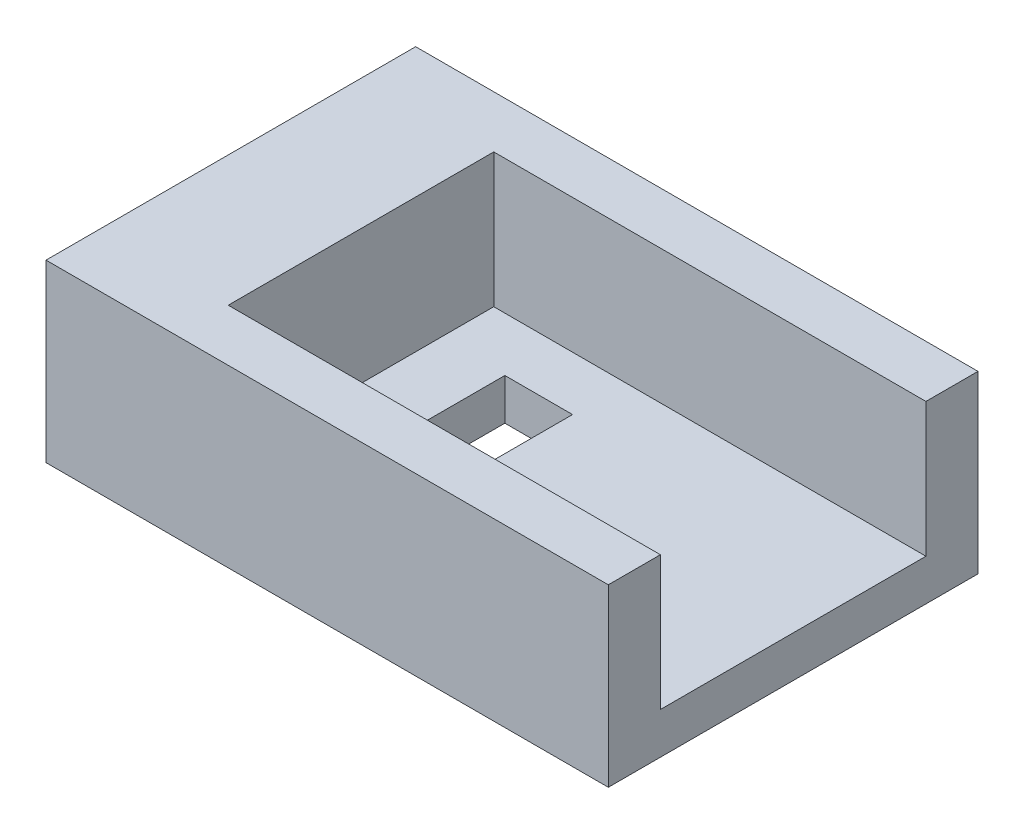
ISO-10303-21;
HEADER;
FILE_DESCRIPTION(('STEP AP214'),'2;1');
FILE_NAME('part.step','',(''),(''),'','','');
FILE_SCHEMA(('AUTOMOTIVE_DESIGN { 1 0 10303 214 1 1 1 1 }'));
ENDSEC;
DATA;
#1=APPLICATION_CONTEXT('core data for automotive mechanical design processes');
#2=APPLICATION_PROTOCOL_DEFINITION('international standard','automotive_design',2000,#1);
#3=PRODUCT_CONTEXT('',#1,'mechanical');
#4=PRODUCT('Part','Part','',(#3));
#5=PRODUCT_RELATED_PRODUCT_CATEGORY('part','',(#4));
#6=PRODUCT_DEFINITION_FORMATION('','',#4);
#7=PRODUCT_DEFINITION_CONTEXT('part definition',#1,'design');
#8=PRODUCT_DEFINITION('design','',#6,#7);
#9=PRODUCT_DEFINITION_SHAPE('','',#8);
#10=(LENGTH_UNIT() NAMED_UNIT(*) SI_UNIT(.MILLI.,.METRE.));
#11=(NAMED_UNIT(*) PLANE_ANGLE_UNIT() SI_UNIT($,.RADIAN.));
#12=(NAMED_UNIT(*) SI_UNIT($,.STERADIAN.) SOLID_ANGLE_UNIT());
#13=UNCERTAINTY_MEASURE_WITH_UNIT(LENGTH_MEASURE(1.E-05),#10,'distance_accuracy_value','');
#14=(GEOMETRIC_REPRESENTATION_CONTEXT(3) GLOBAL_UNCERTAINTY_ASSIGNED_CONTEXT((#13)) GLOBAL_UNIT_ASSIGNED_CONTEXT((#10,
#11,#12)) REPRESENTATION_CONTEXT('',''));
#15=CARTESIAN_POINT('',(0.,0.,0.));
#16=DIRECTION('',(0.,0.,1.));
#17=DIRECTION('',(1.,0.,0.));
#18=AXIS2_PLACEMENT_3D('',#15,#16,#17);
#19=CARTESIAN_POINT('',(0.,13.4747,0.));
#20=DIRECTION('',(1.,0.,0.));
#21=DIRECTION('',(0.,0.,-1.));
#22=AXIS2_PLACEMENT_3D('',#19,#20,#21);
#23=PLANE('',#22);
#24=DIRECTION('',(0.,0.,1.));
#25=VECTOR('',#24,1.);
#26=CARTESIAN_POINT('',(0.,0.,0.));
#27=LINE('',#26,#25);
#28=CARTESIAN_POINT('',(0.,0.,-28.39974));
#29=VERTEX_POINT('',#28);
#30=CARTESIAN_POINT('',(0.,0.,0.));
#31=VERTEX_POINT('',#30);
#32=EDGE_CURVE('E214',#29,#31,#27,.T.);
#33=ORIENTED_EDGE('',*,*,#32,.T.);
#34=DIRECTION('',(0.,-1.,0.));
#35=VECTOR('',#34,1.);
#36=CARTESIAN_POINT('',(0.,13.4747,0.));
#37=LINE('',#36,#35);
#38=CARTESIAN_POINT('',(0.,13.4747,0.));
#39=VERTEX_POINT('',#38);
#40=EDGE_CURVE('E11',#39,#31,#37,.T.);
#41=ORIENTED_EDGE('',*,*,#40,.F.);
#42=DIRECTION('',(0.,0.,1.));
#43=VECTOR('',#42,1.);
#44=CARTESIAN_POINT('',(0.,13.4747,0.));
#45=LINE('',#44,#43);
#46=CARTESIAN_POINT('',(0.,13.4747,-28.39974));
#47=VERTEX_POINT('',#46);
#48=EDGE_CURVE('E223',#47,#39,#45,.T.);
#49=ORIENTED_EDGE('',*,*,#48,.F.);
#50=DIRECTION('',(0.,-1.,0.));
#51=VECTOR('',#50,1.);
#52=CARTESIAN_POINT('',(0.,13.4747,-28.39974));
#53=LINE('',#52,#51);
#54=EDGE_CURVE('E239',#47,#29,#53,.T.);
#55=ORIENTED_EDGE('',*,*,#54,.T.);
#56=EDGE_LOOP('',(#33,#41,#49,#55));
#57=FACE_BOUND('',#56,.T.);
#58=ADVANCED_FACE('F45',(#57),#23,.F.);
#59=CARTESIAN_POINT('',(0.,13.4747,0.));
#60=DIRECTION('',(0.,0.,-1.));
#61=DIRECTION('',(-1.,0.,0.));
#62=AXIS2_PLACEMENT_3D('',#59,#60,#61);
#63=PLANE('',#62);
#64=DIRECTION('',(1.,0.,0.));
#65=VECTOR('',#64,1.);
#66=CARTESIAN_POINT('',(0.,0.,0.));
#67=LINE('',#66,#65);
#68=CARTESIAN_POINT('',(43.20032,0.,0.));
#69=VERTEX_POINT('',#68);
#70=EDGE_CURVE('E243',#31,#69,#67,.T.);
#71=ORIENTED_EDGE('',*,*,#70,.T.);
#72=DIRECTION('',(0.,-1.,0.));
#73=VECTOR('',#72,1.);
#74=CARTESIAN_POINT('',(43.20032,13.4747,0.));
#75=LINE('',#74,#73);
#76=CARTESIAN_POINT('',(43.20032,13.4747,0.));
#77=VERTEX_POINT('',#76);
#78=EDGE_CURVE('E53',#77,#69,#75,.T.);
#79=ORIENTED_EDGE('',*,*,#78,.F.);
#80=DIRECTION('',(1.,0.,0.));
#81=VECTOR('',#80,1.);
#82=CARTESIAN_POINT('',(0.,13.4747,0.));
#83=LINE('',#82,#81);
#84=EDGE_CURVE('E227',#39,#77,#83,.T.);
#85=ORIENTED_EDGE('',*,*,#84,.F.);
#86=ORIENTED_EDGE('',*,*,#40,.T.);
#87=EDGE_LOOP('',(#71,#79,#85,#86));
#88=FACE_BOUND('',#87,.T.);
#89=ADVANCED_FACE('F303',(#88),#63,.F.);
#90=CARTESIAN_POINT('',(43.20032,13.4747,0.));
#91=DIRECTION('',(-1.,0.,0.));
#92=DIRECTION('',(0.,0.,1.));
#93=AXIS2_PLACEMENT_3D('',#90,#91,#92);
#94=PLANE('',#93);
#95=DIRECTION('',(0.,0.,-1.));
#96=VECTOR('',#95,1.);
#97=CARTESIAN_POINT('',(43.20032,3.175,-24.39924));
#98=LINE('',#97,#96);
#99=CARTESIAN_POINT('',(43.20032,3.175,-4.0005));
#100=VERTEX_POINT('',#99);
#101=CARTESIAN_POINT('',(43.20032,3.175,-24.39924));
#102=VERTEX_POINT('',#101);
#103=EDGE_CURVE('E183',#100,#102,#98,.T.);
#104=ORIENTED_EDGE('',*,*,#103,.F.);
#105=DIRECTION('',(0.,1.,0.));
#106=VECTOR('',#105,1.);
#107=CARTESIAN_POINT('',(43.20032,3.175,-4.0005));
#108=LINE('',#107,#106);
#109=CARTESIAN_POINT('',(43.20032,13.4747,-4.0005));
#110=VERTEX_POINT('',#109);
#111=EDGE_CURVE('E210',#100,#110,#108,.T.);
#112=ORIENTED_EDGE('',*,*,#111,.T.);
#113=DIRECTION('',(0.,0.,-1.));
#114=VECTOR('',#113,1.);
#115=CARTESIAN_POINT('',(43.20032,13.4747,0.));
#116=LINE('',#115,#114);
#117=EDGE_CURVE('E232',#77,#110,#116,.T.);
#118=ORIENTED_EDGE('',*,*,#117,.F.);
#119=ORIENTED_EDGE('',*,*,#78,.T.);
#120=DIRECTION('',(0.,0.,-1.));
#121=VECTOR('',#120,1.);
#122=CARTESIAN_POINT('',(43.20032,0.,0.));
#123=LINE('',#122,#121);
#124=CARTESIAN_POINT('',(43.20032,0.,-28.39974));
#125=VERTEX_POINT('',#124);
#126=EDGE_CURVE('E246',#69,#125,#123,.T.);
#127=ORIENTED_EDGE('',*,*,#126,.T.);
#128=DIRECTION('',(0.,-1.,0.));
#129=VECTOR('',#128,1.);
#130=CARTESIAN_POINT('',(43.20032,13.4747,-28.39974));
#131=LINE('',#130,#129);
#132=CARTESIAN_POINT('',(43.20032,13.4747,-28.39974));
#133=VERTEX_POINT('',#132);
#134=EDGE_CURVE('E254',#133,#125,#131,.T.);
#135=ORIENTED_EDGE('',*,*,#134,.F.);
#136=CARTESIAN_POINT('',(43.20032,13.4747,-24.39924));
#137=VERTEX_POINT('',#136);
#138=EDGE_CURVE('E231',#137,#133,#116,.T.);
#139=ORIENTED_EDGE('',*,*,#138,.F.);
#140=DIRECTION('',(0.,1.,0.));
#141=VECTOR('',#140,1.);
#142=CARTESIAN_POINT('',(43.20032,3.175,-24.39924));
#143=LINE('',#142,#141);
#144=EDGE_CURVE('E200',#102,#137,#143,.T.);
#145=ORIENTED_EDGE('',*,*,#144,.F.);
#146=EDGE_LOOP('',(#104,#112,#118,#119,#127,#135,#139,#145));
#147=FACE_BOUND('',#146,.T.);
#148=ADVANCED_FACE('F264',(#147),#94,.F.);
#149=CARTESIAN_POINT('',(0.,13.4747,-28.39974));
#150=DIRECTION('',(0.,0.,1.));
#151=DIRECTION('',(1.,0.,0.));
#152=AXIS2_PLACEMENT_3D('',#149,#150,#151);
#153=PLANE('',#152);
#154=DIRECTION('',(-1.,0.,0.));
#155=VECTOR('',#154,1.);
#156=CARTESIAN_POINT('',(0.,0.,-28.39974));
#157=LINE('',#156,#155);
#158=EDGE_CURVE('E228',#125,#29,#157,.T.);
#159=ORIENTED_EDGE('',*,*,#158,.T.);
#160=ORIENTED_EDGE('',*,*,#54,.F.);
#161=DIRECTION('',(-1.,0.,0.));
#162=VECTOR('',#161,1.);
#163=CARTESIAN_POINT('',(0.,13.4747,-28.39974));
#164=LINE('',#163,#162);
#165=EDGE_CURVE('E236',#133,#47,#164,.T.);
#166=ORIENTED_EDGE('',*,*,#165,.F.);
#167=ORIENTED_EDGE('',*,*,#134,.T.);
#168=EDGE_LOOP('',(#159,#160,#166,#167));
#169=FACE_BOUND('',#168,.T.);
#170=ADVANCED_FACE('F271',(#169),#153,.F.);
#171=CARTESIAN_POINT('',(0.,13.4747,0.));
#172=DIRECTION('',(0.,-1.,0.));
#173=DIRECTION('',(0.,0.,-1.));
#174=AXIS2_PLACEMENT_3D('',#171,#172,#173);
#175=PLANE('',#174);
#176=ORIENTED_EDGE('',*,*,#117,.T.);
#177=DIRECTION('',(1.,0.,0.));
#178=VECTOR('',#177,1.);
#179=CARTESIAN_POINT('',(43.20032,13.4747,-4.0005));
#180=LINE('',#179,#178);
#181=CARTESIAN_POINT('',(9.99998,13.4747,-4.0005));
#182=VERTEX_POINT('',#181);
#183=EDGE_CURVE('E188',#182,#110,#180,.T.);
#184=ORIENTED_EDGE('',*,*,#183,.F.);
#185=DIRECTION('',(0.,0.,1.));
#186=VECTOR('',#185,1.);
#187=CARTESIAN_POINT('',(9.99998,13.4747,-24.39924));
#188=LINE('',#187,#186);
#189=CARTESIAN_POINT('',(9.99998,13.4747,-24.39924));
#190=VERTEX_POINT('',#189);
#191=EDGE_CURVE('E204',#190,#182,#188,.T.);
#192=ORIENTED_EDGE('',*,*,#191,.F.);
#193=DIRECTION('',(-1.,0.,0.));
#194=VECTOR('',#193,1.);
#195=CARTESIAN_POINT('',(43.20032,13.4747,-24.39924));
#196=LINE('',#195,#194);
#197=EDGE_CURVE('E177',#137,#190,#196,.T.);
#198=ORIENTED_EDGE('',*,*,#197,.F.);
#199=ORIENTED_EDGE('',*,*,#138,.T.);
#200=ORIENTED_EDGE('',*,*,#165,.T.);
#201=ORIENTED_EDGE('',*,*,#48,.T.);
#202=ORIENTED_EDGE('',*,*,#84,.T.);
#203=EDGE_LOOP('',(#176,#184,#192,#198,#199,#200,#201,#202));
#204=FACE_BOUND('',#203,.T.);
#205=ADVANCED_FACE('F277',(#204),#175,.F.);
#206=CARTESIAN_POINT('',(0.,0.,0.));
#207=DIRECTION('',(0.,-1.,0.));
#208=DIRECTION('',(0.,0.,-1.));
#209=AXIS2_PLACEMENT_3D('',#206,#207,#208);
#210=PLANE('',#209);
#211=DIRECTION('',(0.,0.,1.));
#212=VECTOR('',#211,1.);
#213=CARTESIAN_POINT('',(15.00124,0.,-20.25015));
#214=LINE('',#213,#212);
#215=CARTESIAN_POINT('',(15.00124,0.,-20.25015));
#216=VERTEX_POINT('',#215);
#217=CARTESIAN_POINT('',(15.00124,0.,-8.14959));
#218=VERTEX_POINT('',#217);
#219=EDGE_CURVE('E136',#216,#218,#214,.T.);
#220=ORIENTED_EDGE('',*,*,#219,.T.);
#221=DIRECTION('',(1.,0.,0.));
#222=VECTOR('',#221,1.);
#223=CARTESIAN_POINT('',(15.00124,0.,-8.14959));
#224=LINE('',#223,#222);
#225=CARTESIAN_POINT('',(20.20062,0.,-8.14959));
#226=VERTEX_POINT('',#225);
#227=EDGE_CURVE('E146',#218,#226,#224,.T.);
#228=ORIENTED_EDGE('',*,*,#227,.T.);
#229=DIRECTION('',(0.,0.,-1.));
#230=VECTOR('',#229,1.);
#231=CARTESIAN_POINT('',(20.20062,0.,-20.25015));
#232=LINE('',#231,#230);
#233=CARTESIAN_POINT('',(20.20062,0.,-20.25015));
#234=VERTEX_POINT('',#233);
#235=EDGE_CURVE('E60',#226,#234,#232,.T.);
#236=ORIENTED_EDGE('',*,*,#235,.T.);
#237=DIRECTION('',(-1.,0.,0.));
#238=VECTOR('',#237,1.);
#239=CARTESIAN_POINT('',(15.00124,0.,-20.25015));
#240=LINE('',#239,#238);
#241=EDGE_CURVE('E143',#234,#216,#240,.T.);
#242=ORIENTED_EDGE('',*,*,#241,.T.);
#243=EDGE_LOOP('',(#220,#228,#236,#242));
#244=FACE_BOUND('',#243,.T.);
#245=ORIENTED_EDGE('',*,*,#32,.F.);
#246=ORIENTED_EDGE('',*,*,#158,.F.);
#247=ORIENTED_EDGE('',*,*,#126,.F.);
#248=ORIENTED_EDGE('',*,*,#70,.F.);
#249=EDGE_LOOP('',(#245,#246,#247,#248));
#250=FACE_BOUND('',#249,.T.);
#251=ADVANCED_FACE('F151',(#244,#250),#210,.T.);
#252=CARTESIAN_POINT('',(43.20032,3.175,-4.0005));
#253=DIRECTION('',(0.,0.,1.));
#254=DIRECTION('',(1.,0.,0.));
#255=AXIS2_PLACEMENT_3D('',#252,#253,#254);
#256=PLANE('',#255);
#257=ORIENTED_EDGE('',*,*,#183,.T.);
#258=ORIENTED_EDGE('',*,*,#111,.F.);
#259=DIRECTION('',(1.,0.,0.));
#260=VECTOR('',#259,1.);
#261=CARTESIAN_POINT('',(43.20032,3.175,-4.0005));
#262=LINE('',#261,#260);
#263=CARTESIAN_POINT('',(9.99998,3.175,-4.0005));
#264=VERTEX_POINT('',#263);
#265=EDGE_CURVE('E196',#264,#100,#262,.T.);
#266=ORIENTED_EDGE('',*,*,#265,.F.);
#267=DIRECTION('',(0.,1.,0.));
#268=VECTOR('',#267,1.);
#269=CARTESIAN_POINT('',(9.99998,3.175,-4.0005));
#270=LINE('',#269,#268);
#271=EDGE_CURVE('E215',#264,#182,#270,.T.);
#272=ORIENTED_EDGE('',*,*,#271,.T.);
#273=EDGE_LOOP('',(#257,#258,#266,#272));
#274=FACE_BOUND('',#273,.T.);
#275=ADVANCED_FACE('F290',(#274),#256,.F.);
#276=CARTESIAN_POINT('',(9.99998,3.175,-24.39924));
#277=DIRECTION('',(-1.,0.,0.));
#278=DIRECTION('',(0.,0.,1.));
#279=AXIS2_PLACEMENT_3D('',#276,#277,#278);
#280=PLANE('',#279);
#281=ORIENTED_EDGE('',*,*,#191,.T.);
#282=ORIENTED_EDGE('',*,*,#271,.F.);
#283=DIRECTION('',(0.,0.,1.));
#284=VECTOR('',#283,1.);
#285=CARTESIAN_POINT('',(9.99998,3.175,-24.39924));
#286=LINE('',#285,#284);
#287=CARTESIAN_POINT('',(9.99998,3.175,-24.39924));
#288=VERTEX_POINT('',#287);
#289=EDGE_CURVE('E192',#288,#264,#286,.T.);
#290=ORIENTED_EDGE('',*,*,#289,.F.);
#291=DIRECTION('',(0.,1.,0.));
#292=VECTOR('',#291,1.);
#293=CARTESIAN_POINT('',(9.99998,3.175,-24.39924));
#294=LINE('',#293,#292);
#295=EDGE_CURVE('E218',#288,#190,#294,.T.);
#296=ORIENTED_EDGE('',*,*,#295,.T.);
#297=EDGE_LOOP('',(#281,#282,#290,#296));
#298=FACE_BOUND('',#297,.T.);
#299=ADVANCED_FACE('F293',(#298),#280,.F.);
#300=CARTESIAN_POINT('',(43.20032,3.175,-24.39924));
#301=DIRECTION('',(0.,0.,-1.));
#302=DIRECTION('',(-1.,0.,0.));
#303=AXIS2_PLACEMENT_3D('',#300,#301,#302);
#304=PLANE('',#303);
#305=ORIENTED_EDGE('',*,*,#197,.T.);
#306=ORIENTED_EDGE('',*,*,#295,.F.);
#307=DIRECTION('',(-1.,0.,0.));
#308=VECTOR('',#307,1.);
#309=CARTESIAN_POINT('',(43.20032,3.175,-24.39924));
#310=LINE('',#309,#308);
#311=EDGE_CURVE('E187',#102,#288,#310,.T.);
#312=ORIENTED_EDGE('',*,*,#311,.F.);
#313=ORIENTED_EDGE('',*,*,#144,.T.);
#314=EDGE_LOOP('',(#305,#306,#312,#313));
#315=FACE_BOUND('',#314,.T.);
#316=ADVANCED_FACE('F284',(#315),#304,.F.);
#317=CARTESIAN_POINT('',(0.,3.175,0.));
#318=DIRECTION('',(0.,-1.,0.));
#319=DIRECTION('',(0.,0.,-1.));
#320=AXIS2_PLACEMENT_3D('',#317,#318,#319);
#321=PLANE('',#320);
#322=DIRECTION('',(1.,0.,0.));
#323=VECTOR('',#322,1.);
#324=CARTESIAN_POINT('',(15.00124,3.175,-8.14959));
#325=LINE('',#324,#323);
#326=CARTESIAN_POINT('',(15.00124,3.175,-8.14959));
#327=VERTEX_POINT('',#326);
#328=CARTESIAN_POINT('',(20.20062,3.175,-8.14959));
#329=VERTEX_POINT('',#328);
#330=EDGE_CURVE('E168',#327,#329,#325,.T.);
#331=ORIENTED_EDGE('',*,*,#330,.F.);
#332=DIRECTION('',(0.,0.,1.));
#333=VECTOR('',#332,1.);
#334=CARTESIAN_POINT('',(15.00124,3.175,-20.25015));
#335=LINE('',#334,#333);
#336=CARTESIAN_POINT('',(15.00124,3.175,-20.25015));
#337=VERTEX_POINT('',#336);
#338=EDGE_CURVE('E68',#337,#327,#335,.T.);
#339=ORIENTED_EDGE('',*,*,#338,.F.);
#340=DIRECTION('',(-1.,0.,0.));
#341=VECTOR('',#340,1.);
#342=CARTESIAN_POINT('',(15.00124,3.175,-20.25015));
#343=LINE('',#342,#341);
#344=CARTESIAN_POINT('',(20.20062,3.175,-20.25015));
#345=VERTEX_POINT('',#344);
#346=EDGE_CURVE('E155',#345,#337,#343,.T.);
#347=ORIENTED_EDGE('',*,*,#346,.F.);
#348=DIRECTION('',(0.,0.,-1.));
#349=VECTOR('',#348,1.);
#350=CARTESIAN_POINT('',(20.20062,3.175,-20.25015));
#351=LINE('',#350,#349);
#352=EDGE_CURVE('E159',#329,#345,#351,.T.);
#353=ORIENTED_EDGE('',*,*,#352,.F.);
#354=EDGE_LOOP('',(#331,#339,#347,#353));
#355=FACE_BOUND('',#354,.T.);
#356=ORIENTED_EDGE('',*,*,#103,.T.);
#357=ORIENTED_EDGE('',*,*,#311,.T.);
#358=ORIENTED_EDGE('',*,*,#289,.T.);
#359=ORIENTED_EDGE('',*,*,#265,.T.);
#360=EDGE_LOOP('',(#356,#357,#358,#359));
#361=FACE_BOUND('',#360,.T.);
#362=ADVANCED_FACE('F287',(#355,#361),#321,.F.);
#363=CARTESIAN_POINT('',(15.00124,0.,-20.25015));
#364=DIRECTION('',(-1.,0.,0.));
#365=DIRECTION('',(0.,0.,1.));
#366=AXIS2_PLACEMENT_3D('',#363,#364,#365);
#367=PLANE('',#366);
#368=ORIENTED_EDGE('',*,*,#338,.T.);
#369=DIRECTION('',(0.,1.,0.));
#370=VECTOR('',#369,1.);
#371=CARTESIAN_POINT('',(15.00124,0.,-8.14959));
#372=LINE('',#371,#370);
#373=EDGE_CURVE('E132',#218,#327,#372,.T.);
#374=ORIENTED_EDGE('',*,*,#373,.F.);
#375=ORIENTED_EDGE('',*,*,#219,.F.);
#376=DIRECTION('',(0.,1.,0.));
#377=VECTOR('',#376,1.);
#378=CARTESIAN_POINT('',(15.00124,0.,-20.25015));
#379=LINE('',#378,#377);
#380=EDGE_CURVE('E174',#216,#337,#379,.T.);
#381=ORIENTED_EDGE('',*,*,#380,.T.);
#382=EDGE_LOOP('',(#368,#374,#375,#381));
#383=FACE_BOUND('',#382,.T.);
#384=ADVANCED_FACE('F134',(#383),#367,.F.);
#385=CARTESIAN_POINT('',(15.00124,0.,-20.25015));
#386=DIRECTION('',(0.,0.,-1.));
#387=DIRECTION('',(-1.,0.,0.));
#388=AXIS2_PLACEMENT_3D('',#385,#386,#387);
#389=PLANE('',#388);
#390=ORIENTED_EDGE('',*,*,#346,.T.);
#391=ORIENTED_EDGE('',*,*,#380,.F.);
#392=ORIENTED_EDGE('',*,*,#241,.F.);
#393=DIRECTION('',(0.,1.,0.));
#394=VECTOR('',#393,1.);
#395=CARTESIAN_POINT('',(20.20062,0.,-20.25015));
#396=LINE('',#395,#394);
#397=EDGE_CURVE('E178',#234,#345,#396,.T.);
#398=ORIENTED_EDGE('',*,*,#397,.T.);
#399=EDGE_LOOP('',(#390,#391,#392,#398));
#400=FACE_BOUND('',#399,.T.);
#401=ADVANCED_FACE('F360',(#400),#389,.F.);
#402=CARTESIAN_POINT('',(20.20062,0.,-20.25015));
#403=DIRECTION('',(1.,0.,0.));
#404=DIRECTION('',(0.,0.,-1.));
#405=AXIS2_PLACEMENT_3D('',#402,#403,#404);
#406=PLANE('',#405);
#407=ORIENTED_EDGE('',*,*,#352,.T.);
#408=ORIENTED_EDGE('',*,*,#397,.F.);
#409=ORIENTED_EDGE('',*,*,#235,.F.);
#410=DIRECTION('',(0.,1.,0.));
#411=VECTOR('',#410,1.);
#412=CARTESIAN_POINT('',(20.20062,0.,-8.14959));
#413=LINE('',#412,#411);
#414=EDGE_CURVE('E142',#226,#329,#413,.T.);
#415=ORIENTED_EDGE('',*,*,#414,.T.);
#416=EDGE_LOOP('',(#407,#408,#409,#415));
#417=FACE_BOUND('',#416,.T.);
#418=ADVANCED_FACE('F369',(#417),#406,.F.);
#419=CARTESIAN_POINT('',(15.00124,0.,-8.14959));
#420=DIRECTION('',(0.,0.,1.));
#421=DIRECTION('',(1.,0.,0.));
#422=AXIS2_PLACEMENT_3D('',#419,#420,#421);
#423=PLANE('',#422);
#424=ORIENTED_EDGE('',*,*,#330,.T.);
#425=ORIENTED_EDGE('',*,*,#414,.F.);
#426=ORIENTED_EDGE('',*,*,#227,.F.);
#427=ORIENTED_EDGE('',*,*,#373,.T.);
#428=EDGE_LOOP('',(#424,#425,#426,#427));
#429=FACE_BOUND('',#428,.T.);
#430=ADVANCED_FACE('F147',(#429),#423,.F.);
#431=CLOSED_SHELL('',(#58,#89,#148,#170,#205,#251,#275,#299,#316,#362,#384,#401,#418,#430));
#432=MANIFOLD_SOLID_BREP('B2',#431);
#433=ADVANCED_BREP_SHAPE_REPRESENTATION('',(#18,#432),#14);
#434=SHAPE_DEFINITION_REPRESENTATION(#9,#433);
ENDSEC;
END-ISO-10303-21;
